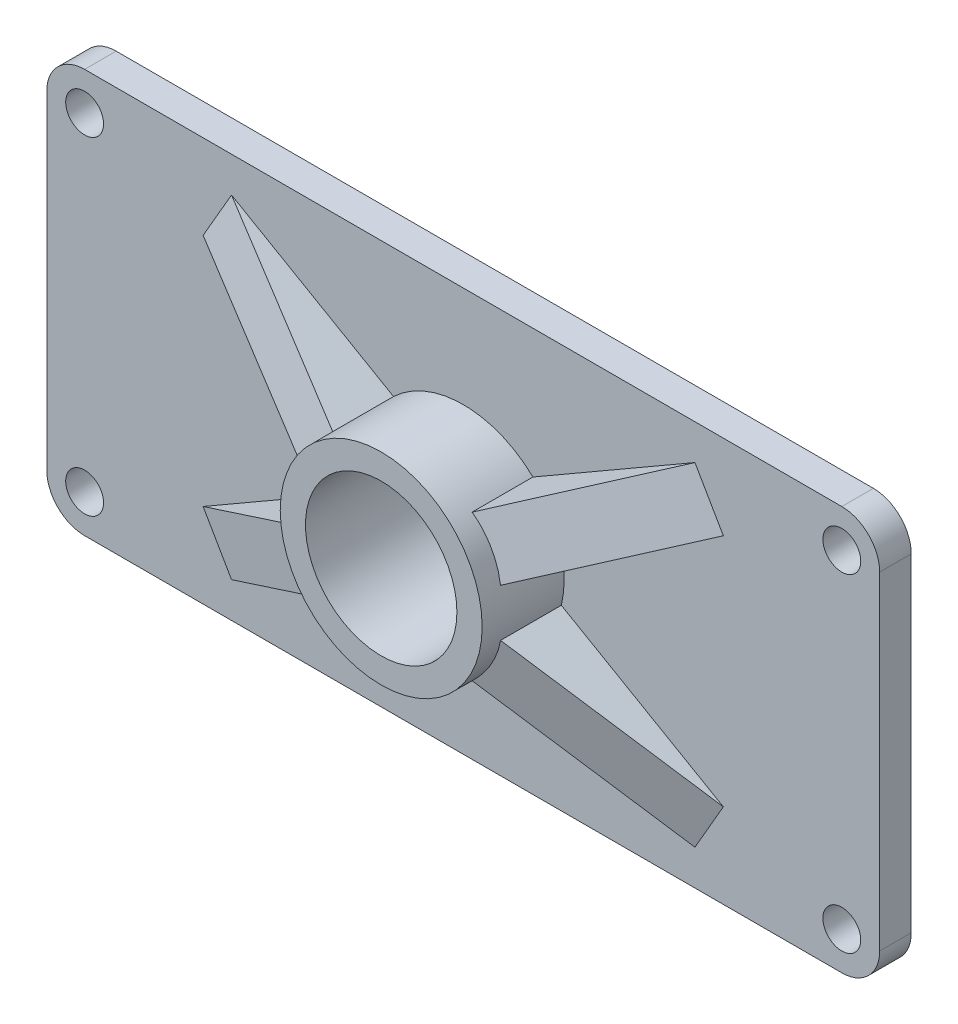
ISO-10303-21;
HEADER;
FILE_DESCRIPTION(('STEP AP214'),'2;1');
FILE_NAME('part.step','',(''),(''),'','','');
FILE_SCHEMA(('AUTOMOTIVE_DESIGN { 1 0 10303 214 1 1 1 1 }'));
ENDSEC;
DATA;
#1=APPLICATION_CONTEXT('core data for automotive mechanical design processes');
#2=APPLICATION_PROTOCOL_DEFINITION('international standard','automotive_design',2000,#1);
#3=PRODUCT_CONTEXT('',#1,'mechanical');
#4=PRODUCT('Part','Part','',(#3));
#5=PRODUCT_RELATED_PRODUCT_CATEGORY('part','',(#4));
#6=PRODUCT_DEFINITION_FORMATION('','',#4);
#7=PRODUCT_DEFINITION_CONTEXT('part definition',#1,'design');
#8=PRODUCT_DEFINITION('design','',#6,#7);
#9=PRODUCT_DEFINITION_SHAPE('','',#8);
#10=(LENGTH_UNIT() NAMED_UNIT(*) SI_UNIT(.MILLI.,.METRE.));
#11=(NAMED_UNIT(*) PLANE_ANGLE_UNIT() SI_UNIT($,.RADIAN.));
#12=(NAMED_UNIT(*) SI_UNIT($,.STERADIAN.) SOLID_ANGLE_UNIT());
#13=UNCERTAINTY_MEASURE_WITH_UNIT(LENGTH_MEASURE(1.E-05),#10,'distance_accuracy_value','');
#14=(GEOMETRIC_REPRESENTATION_CONTEXT(3) GLOBAL_UNCERTAINTY_ASSIGNED_CONTEXT((#13)) GLOBAL_UNIT_ASSIGNED_CONTEXT((#10,
#11,#12)) REPRESENTATION_CONTEXT('',''));
#15=CARTESIAN_POINT('',(0.,0.,0.));
#16=DIRECTION('',(0.,0.,1.));
#17=DIRECTION('',(1.,0.,0.));
#18=AXIS2_PLACEMENT_3D('',#15,#16,#17);
#19=CARTESIAN_POINT('',(60.,26.,5.));
#20=DIRECTION('',(0.,0.,-1.));
#21=DIRECTION('',(-1.,0.,0.));
#22=AXIS2_PLACEMENT_3D('',#19,#20,#21);
#23=PLANE('',#22);
#24=CARTESIAN_POINT('',(60.,26.,5.));
#25=DIRECTION('',(0.,0.,1.));
#26=DIRECTION('',(1.,0.,0.));
#27=AXIS2_PLACEMENT_3D('',#24,#25,#26);
#28=CIRCLE('',#27,3.);
#29=CARTESIAN_POINT('',(63.,26.,5.));
#30=VERTEX_POINT('',#29);
#31=EDGE_CURVE('E263',#30,#30,#28,.T.);
#32=ORIENTED_EDGE('',*,*,#31,.F.);
#33=EDGE_LOOP('',(#32));
#34=FACE_BOUND('',#33,.T.);
#35=DIRECTION('',(0.500000000000001,-0.866025403784438,0.));
#36=VECTOR('',#35,1.);
#37=CARTESIAN_POINT('',(42.712812921102,16.0192378864668,5.));
#38=LINE('',#37,#36);
#39=CARTESIAN_POINT('',(36.7211431702997,26.39711431703,5.));
#40=VERTEX_POINT('',#39);
#41=CARTESIAN_POINT('',(41.2211431702998,18.6028856829701,4.99999999999999));
#42=VERTEX_POINT('',#41);
#43=EDGE_CURVE('E215',#40,#42,#38,.T.);
#44=ORIENTED_EDGE('',*,*,#43,.T.);
#45=DIRECTION('',(0.866025403784438,0.500000000000001,0.));
#46=VECTOR('',#45,1.);
#47=CARTESIAN_POINT('',(58.5083302491977,28.5836477965033,5.));
#48=LINE('',#47,#46);
#49=CARTESIAN_POINT('',(15.5470861469722,3.77996194936208,5.));
#50=VERTEX_POINT('',#49);
#51=EDGE_CURVE('E208',#50,#42,#48,.T.);
#52=ORIENTED_EDGE('',*,*,#51,.F.);
#53=CARTESIAN_POINT('',(0.,0.,5.));
#54=DIRECTION('',(0.,0.,-1.));
#55=DIRECTION('',(-1.,0.,0.));
#56=AXIS2_PLACEMENT_3D('',#53,#54,#55);
#57=CIRCLE('',#56,16.);
#58=CARTESIAN_POINT('',(15.5470861469722,-3.77996194936208,5.));
#59=VERTEX_POINT('',#58);
#60=EDGE_CURVE('E189',#59,#50,#57,.F.);
#61=ORIENTED_EDGE('',*,*,#60,.F.);
#62=DIRECTION('',(-0.866025403784438,0.500000000000001,0.));
#63=VECTOR('',#62,1.);
#64=CARTESIAN_POINT('',(35.9916697508022,-15.5836477965032,5.));
#65=LINE('',#64,#63);
#66=CARTESIAN_POINT('',(41.2211431702997,-18.6028856829701,5.));
#67=VERTEX_POINT('',#66);
#68=EDGE_CURVE('E237',#67,#59,#65,.T.);
#69=ORIENTED_EDGE('',*,*,#68,.F.);
#70=DIRECTION('',(0.500000000000001,0.866025403784438,0.));
#71=VECTOR('',#70,1.);
#72=CARTESIAN_POINT('',(65.2294734194975,22.9807621135331,5.));
#73=LINE('',#72,#71);
#74=CARTESIAN_POINT('',(36.7211431702997,-26.39711431703,5.));
#75=VERTEX_POINT('',#74);
#76=EDGE_CURVE('E245',#67,#75,#73,.F.);
#77=ORIENTED_EDGE('',*,*,#76,.T.);
#78=DIRECTION('',(-0.866025403784438,0.500000000000001,0.));
#79=VECTOR('',#78,1.);
#80=CARTESIAN_POINT('',(31.4916697508022,-23.3778764305631,5.));
#81=LINE('',#80,#79);
#82=CARTESIAN_POINT('',(11.0470861469722,-11.574190583422,5.));
#83=VERTEX_POINT('',#82);
#84=EDGE_CURVE('E242',#75,#83,#81,.T.);
#85=ORIENTED_EDGE('',*,*,#84,.T.);
#86=CARTESIAN_POINT('',(-11.0470861469722,-11.574190583422,5.));
#87=VERTEX_POINT('',#86);
#88=EDGE_CURVE('E187',#87,#83,#57,.F.);
#89=ORIENTED_EDGE('',*,*,#88,.F.);
#90=DIRECTION('',(-0.866025403784438,-0.500000000000001,0.));
#91=VECTOR('',#90,1.);
#92=CARTESIAN_POINT('',(58.5083302491977,28.5836477965033,5.));
#93=LINE('',#92,#91);
#94=CARTESIAN_POINT('',(-36.7211431702997,-26.39711431703,5.));
#95=VERTEX_POINT('',#94);
#96=EDGE_CURVE('E58',#87,#95,#93,.T.);
#97=ORIENTED_EDGE('',*,*,#96,.T.);
#98=DIRECTION('',(-0.500000000000001,0.866025403784438,0.));
#99=VECTOR('',#98,1.);
#100=CARTESIAN_POINT('',(-35.2294734194974,-28.9807621135333,5.));
#101=LINE('',#100,#99);
#102=CARTESIAN_POINT('',(-41.2211431702996,-18.60288568297,5.00000000000002));
#103=VERTEX_POINT('',#102);
#104=EDGE_CURVE('E62',#95,#103,#101,.T.);
#105=ORIENTED_EDGE('',*,*,#104,.T.);
#106=DIRECTION('',(-0.866025403784438,-0.500000000000001,0.));
#107=VECTOR('',#106,1.);
#108=CARTESIAN_POINT('',(54.0083302491977,36.3778764305632,5.));
#109=LINE('',#108,#107);
#110=CARTESIAN_POINT('',(-15.5470861469722,-3.77996194936209,5.));
#111=VERTEX_POINT('',#110);
#112=EDGE_CURVE('E190',#111,#103,#109,.T.);
#113=ORIENTED_EDGE('',*,*,#112,.F.);
#114=CARTESIAN_POINT('',(-15.5470861469722,3.77996194936209,5.));
#115=VERTEX_POINT('',#114);
#116=EDGE_CURVE('E178',#115,#111,#57,.F.);
#117=ORIENTED_EDGE('',*,*,#116,.F.);
#118=DIRECTION('',(0.866025403784438,-0.500000000000001,0.));
#119=VECTOR('',#118,1.);
#120=CARTESIAN_POINT('',(31.4916697508022,-23.3778764305631,5.));
#121=LINE('',#120,#119);
#122=CARTESIAN_POINT('',(-41.2211431702996,18.60288568297,5.00000000000002));
#123=VERTEX_POINT('',#122);
#124=EDGE_CURVE('E228',#123,#115,#121,.T.);
#125=ORIENTED_EDGE('',*,*,#124,.F.);
#126=DIRECTION('',(-0.500000000000001,-0.866025403784438,0.));
#127=VECTOR('',#126,1.);
#128=CARTESIAN_POINT('',(-12.7128129211019,67.9807621135332,5.));
#129=LINE('',#128,#127);
#130=CARTESIAN_POINT('',(-36.7211431702997,26.39711431703,5.));
#131=VERTEX_POINT('',#130);
#132=EDGE_CURVE('E230',#123,#131,#129,.F.);
#133=ORIENTED_EDGE('',*,*,#132,.T.);
#134=DIRECTION('',(0.866025403784438,-0.500000000000001,0.));
#135=VECTOR('',#134,1.);
#136=CARTESIAN_POINT('',(35.9916697508022,-15.5836477965032,5.));
#137=LINE('',#136,#135);
#138=CARTESIAN_POINT('',(-11.0470861469722,11.574190583422,5.));
#139=VERTEX_POINT('',#138);
#140=EDGE_CURVE('E224',#131,#139,#137,.T.);
#141=ORIENTED_EDGE('',*,*,#140,.T.);
#142=CARTESIAN_POINT('',(11.0470861469722,11.574190583422,5.));
#143=VERTEX_POINT('',#142);
#144=EDGE_CURVE('E186',#143,#139,#57,.F.);
#145=ORIENTED_EDGE('',*,*,#144,.F.);
#146=DIRECTION('',(0.866025403784438,0.500000000000001,0.));
#147=VECTOR('',#146,1.);
#148=CARTESIAN_POINT('',(54.0083302491977,36.3778764305632,5.));
#149=LINE('',#148,#147);
#150=EDGE_CURVE('E213',#143,#40,#149,.T.);
#151=ORIENTED_EDGE('',*,*,#150,.T.);
#152=EDGE_LOOP('',(#44,#52,#61,#69,#77,#85,#89,#97,#105,#113,#117,#125,#133,#141,#145,#151));
#153=FACE_BOUND('',#152,.T.);
#154=CARTESIAN_POINT('',(-60.,-26.,5.));
#155=DIRECTION('',(0.,0.,1.));
#156=DIRECTION('',(1.,0.,0.));
#157=AXIS2_PLACEMENT_3D('',#154,#155,#156);
#158=CIRCLE('',#157,3.);
#159=CARTESIAN_POINT('',(-57.,-26.,5.));
#160=VERTEX_POINT('',#159);
#161=EDGE_CURVE('E275',#160,#160,#158,.T.);
#162=ORIENTED_EDGE('',*,*,#161,.F.);
#163=EDGE_LOOP('',(#162));
#164=FACE_BOUND('',#163,.T.);
#165=CARTESIAN_POINT('',(60.,-26.,5.));
#166=DIRECTION('',(0.,0.,1.));
#167=DIRECTION('',(1.,0.,0.));
#168=AXIS2_PLACEMENT_3D('',#165,#166,#167);
#169=CIRCLE('',#168,3.);
#170=CARTESIAN_POINT('',(63.,-26.,5.));
#171=VERTEX_POINT('',#170);
#172=EDGE_CURVE('E257',#171,#171,#169,.T.);
#173=ORIENTED_EDGE('',*,*,#172,.F.);
#174=EDGE_LOOP('',(#173));
#175=FACE_BOUND('',#174,.T.);
#176=CARTESIAN_POINT('',(-60.,26.,5.));
#177=DIRECTION('',(0.,0.,1.));
#178=DIRECTION('',(1.,0.,0.));
#179=AXIS2_PLACEMENT_3D('',#176,#177,#178);
#180=CIRCLE('',#179,3.);
#181=CARTESIAN_POINT('',(-57.,26.,5.));
#182=VERTEX_POINT('',#181);
#183=EDGE_CURVE('E269',#182,#182,#180,.T.);
#184=ORIENTED_EDGE('',*,*,#183,.F.);
#185=EDGE_LOOP('',(#184));
#186=FACE_BOUND('',#185,.T.);
#187=CARTESIAN_POINT('',(60.,26.,5.));
#188=DIRECTION('',(0.,0.,1.));
#189=DIRECTION('',(-1.,0.,0.));
#190=AXIS2_PLACEMENT_3D('',#187,#188,#189);
#191=CIRCLE('',#190,6.);
#192=CARTESIAN_POINT('',(66.,26.,5.));
#193=VERTEX_POINT('',#192);
#194=CARTESIAN_POINT('',(60.,32.,5.));
#195=VERTEX_POINT('',#194);
#196=EDGE_CURVE('E281',#193,#195,#191,.T.);
#197=ORIENTED_EDGE('',*,*,#196,.T.);
#198=DIRECTION('',(-1.,0.,0.));
#199=VECTOR('',#198,1.);
#200=CARTESIAN_POINT('',(-60.,32.,5.));
#201=LINE('',#200,#199);
#202=CARTESIAN_POINT('',(-60.,32.,5.));
#203=VERTEX_POINT('',#202);
#204=EDGE_CURVE('E283',#195,#203,#201,.T.);
#205=ORIENTED_EDGE('',*,*,#204,.T.);
#206=CARTESIAN_POINT('',(-60.,26.,5.));
#207=DIRECTION('',(0.,0.,1.));
#208=DIRECTION('',(-1.,0.,0.));
#209=AXIS2_PLACEMENT_3D('',#206,#207,#208);
#210=CIRCLE('',#209,6.);
#211=CARTESIAN_POINT('',(-66.,26.,5.));
#212=VERTEX_POINT('',#211);
#213=EDGE_CURVE('E286',#203,#212,#210,.T.);
#214=ORIENTED_EDGE('',*,*,#213,.T.);
#215=DIRECTION('',(0.,-1.,0.));
#216=VECTOR('',#215,1.);
#217=CARTESIAN_POINT('',(-66.,-26.,5.));
#218=LINE('',#217,#216);
#219=CARTESIAN_POINT('',(-66.,-26.,5.));
#220=VERTEX_POINT('',#219);
#221=EDGE_CURVE('E288',#212,#220,#218,.T.);
#222=ORIENTED_EDGE('',*,*,#221,.T.);
#223=CARTESIAN_POINT('',(-60.,-26.,5.));
#224=DIRECTION('',(0.,0.,1.));
#225=DIRECTION('',(-1.,0.,0.));
#226=AXIS2_PLACEMENT_3D('',#223,#224,#225);
#227=CIRCLE('',#226,6.);
#228=CARTESIAN_POINT('',(-60.,-32.,5.));
#229=VERTEX_POINT('',#228);
#230=EDGE_CURVE('E290',#220,#229,#227,.T.);
#231=ORIENTED_EDGE('',*,*,#230,.T.);
#232=DIRECTION('',(1.,0.,0.));
#233=VECTOR('',#232,1.);
#234=CARTESIAN_POINT('',(-60.,-32.,5.));
#235=LINE('',#234,#233);
#236=CARTESIAN_POINT('',(60.,-32.,5.));
#237=VERTEX_POINT('',#236);
#238=EDGE_CURVE('E292',#229,#237,#235,.T.);
#239=ORIENTED_EDGE('',*,*,#238,.T.);
#240=CARTESIAN_POINT('',(60.,-26.,5.));
#241=DIRECTION('',(0.,0.,1.));
#242=DIRECTION('',(1.,0.,0.));
#243=AXIS2_PLACEMENT_3D('',#240,#241,#242);
#244=CIRCLE('',#243,6.);
#245=CARTESIAN_POINT('',(66.,-26.,5.));
#246=VERTEX_POINT('',#245);
#247=EDGE_CURVE('E294',#237,#246,#244,.T.);
#248=ORIENTED_EDGE('',*,*,#247,.T.);
#249=DIRECTION('',(0.,1.,0.));
#250=VECTOR('',#249,1.);
#251=CARTESIAN_POINT('',(66.,-26.,5.));
#252=LINE('',#251,#250);
#253=EDGE_CURVE('E296',#246,#193,#252,.T.);
#254=ORIENTED_EDGE('',*,*,#253,.T.);
#255=EDGE_LOOP('',(#197,#205,#214,#222,#231,#239,#248,#254));
#256=FACE_BOUND('',#255,.T.);
#257=ADVANCED_FACE('F43',(#34,#153,#164,#175,#186,#256),#23,.F.);
#258=CARTESIAN_POINT('',(60.,26.,0.));
#259=DIRECTION('',(0.,0.,-1.));
#260=DIRECTION('',(-1.,0.,0.));
#261=AXIS2_PLACEMENT_3D('',#258,#259,#260);
#262=PLANE('',#261);
#263=CARTESIAN_POINT('',(60.,26.,0.));
#264=DIRECTION('',(0.,0.,1.));
#265=DIRECTION('',(1.,0.,0.));
#266=AXIS2_PLACEMENT_3D('',#263,#264,#265);
#267=CIRCLE('',#266,3.);
#268=CARTESIAN_POINT('',(63.,26.,0.));
#269=VERTEX_POINT('',#268);
#270=EDGE_CURVE('E260',#269,#269,#267,.T.);
#271=ORIENTED_EDGE('',*,*,#270,.T.);
#272=EDGE_LOOP('',(#271));
#273=FACE_BOUND('',#272,.T.);
#274=CARTESIAN_POINT('',(0.,0.,0.));
#275=DIRECTION('',(0.,0.,1.));
#276=DIRECTION('',(1.,0.,0.));
#277=AXIS2_PLACEMENT_3D('',#274,#275,#276);
#278=CIRCLE('',#277,12.);
#279=CARTESIAN_POINT('',(12.,0.,0.));
#280=VERTEX_POINT('',#279);
#281=EDGE_CURVE('E253',#280,#280,#278,.T.);
#282=ORIENTED_EDGE('',*,*,#281,.T.);
#283=EDGE_LOOP('',(#282));
#284=FACE_BOUND('',#283,.T.);
#285=DIRECTION('',(-1.,0.,0.));
#286=VECTOR('',#285,1.);
#287=CARTESIAN_POINT('',(-60.,32.,0.));
#288=LINE('',#287,#286);
#289=CARTESIAN_POINT('',(60.,32.,0.));
#290=VERTEX_POINT('',#289);
#291=CARTESIAN_POINT('',(-60.,32.,0.));
#292=VERTEX_POINT('',#291);
#293=EDGE_CURVE('E300',#290,#292,#288,.T.);
#294=ORIENTED_EDGE('',*,*,#293,.F.);
#295=CARTESIAN_POINT('',(60.,26.,0.));
#296=DIRECTION('',(0.,0.,1.));
#297=DIRECTION('',(-1.,0.,0.));
#298=AXIS2_PLACEMENT_3D('',#295,#296,#297);
#299=CIRCLE('',#298,6.);
#300=CARTESIAN_POINT('',(66.,26.,0.));
#301=VERTEX_POINT('',#300);
#302=EDGE_CURVE('E278',#301,#290,#299,.T.);
#303=ORIENTED_EDGE('',*,*,#302,.F.);
#304=DIRECTION('',(0.,1.,0.));
#305=VECTOR('',#304,1.);
#306=CARTESIAN_POINT('',(66.,-26.,0.));
#307=LINE('',#306,#305);
#308=CARTESIAN_POINT('',(66.,-26.,0.));
#309=VERTEX_POINT('',#308);
#310=EDGE_CURVE('E284',#309,#301,#307,.T.);
#311=ORIENTED_EDGE('',*,*,#310,.F.);
#312=CARTESIAN_POINT('',(60.,-26.,0.));
#313=DIRECTION('',(0.,0.,1.));
#314=DIRECTION('',(1.,0.,0.));
#315=AXIS2_PLACEMENT_3D('',#312,#313,#314);
#316=CIRCLE('',#315,6.);
#317=CARTESIAN_POINT('',(60.,-32.,0.));
#318=VERTEX_POINT('',#317);
#319=EDGE_CURVE('E310',#318,#309,#316,.T.);
#320=ORIENTED_EDGE('',*,*,#319,.F.);
#321=DIRECTION('',(1.,0.,0.));
#322=VECTOR('',#321,1.);
#323=CARTESIAN_POINT('',(-60.,-32.,0.));
#324=LINE('',#323,#322);
#325=CARTESIAN_POINT('',(-60.,-32.,0.));
#326=VERTEX_POINT('',#325);
#327=EDGE_CURVE('E308',#326,#318,#324,.T.);
#328=ORIENTED_EDGE('',*,*,#327,.F.);
#329=CARTESIAN_POINT('',(-60.,-26.,0.));
#330=DIRECTION('',(0.,0.,1.));
#331=DIRECTION('',(-1.,0.,0.));
#332=AXIS2_PLACEMENT_3D('',#329,#330,#331);
#333=CIRCLE('',#332,6.);
#334=CARTESIAN_POINT('',(-66.,-26.,0.));
#335=VERTEX_POINT('',#334);
#336=EDGE_CURVE('E306',#335,#326,#333,.T.);
#337=ORIENTED_EDGE('',*,*,#336,.F.);
#338=DIRECTION('',(0.,-1.,0.));
#339=VECTOR('',#338,1.);
#340=CARTESIAN_POINT('',(-66.,-26.,0.));
#341=LINE('',#340,#339);
#342=CARTESIAN_POINT('',(-66.,26.,0.));
#343=VERTEX_POINT('',#342);
#344=EDGE_CURVE('E304',#343,#335,#341,.T.);
#345=ORIENTED_EDGE('',*,*,#344,.F.);
#346=CARTESIAN_POINT('',(-60.,26.,0.));
#347=DIRECTION('',(0.,0.,1.));
#348=DIRECTION('',(-1.,0.,0.));
#349=AXIS2_PLACEMENT_3D('',#346,#347,#348);
#350=CIRCLE('',#349,6.);
#351=EDGE_CURVE('E302',#292,#343,#350,.T.);
#352=ORIENTED_EDGE('',*,*,#351,.F.);
#353=EDGE_LOOP('',(#294,#303,#311,#320,#328,#337,#345,#352));
#354=FACE_BOUND('',#353,.T.);
#355=CARTESIAN_POINT('',(60.,-26.,0.));
#356=DIRECTION('',(0.,0.,1.));
#357=DIRECTION('',(1.,0.,0.));
#358=AXIS2_PLACEMENT_3D('',#355,#356,#357);
#359=CIRCLE('',#358,3.);
#360=CARTESIAN_POINT('',(63.,-26.,0.));
#361=VERTEX_POINT('',#360);
#362=EDGE_CURVE('E256',#361,#361,#359,.T.);
#363=ORIENTED_EDGE('',*,*,#362,.T.);
#364=EDGE_LOOP('',(#363));
#365=FACE_BOUND('',#364,.T.);
#366=CARTESIAN_POINT('',(-60.,26.,0.));
#367=DIRECTION('',(0.,0.,1.));
#368=DIRECTION('',(1.,0.,0.));
#369=AXIS2_PLACEMENT_3D('',#366,#367,#368);
#370=CIRCLE('',#369,3.);
#371=CARTESIAN_POINT('',(-57.,26.,0.));
#372=VERTEX_POINT('',#371);
#373=EDGE_CURVE('E266',#372,#372,#370,.T.);
#374=ORIENTED_EDGE('',*,*,#373,.T.);
#375=EDGE_LOOP('',(#374));
#376=FACE_BOUND('',#375,.T.);
#377=CARTESIAN_POINT('',(-60.,-26.,0.));
#378=DIRECTION('',(0.,0.,1.));
#379=DIRECTION('',(1.,0.,0.));
#380=AXIS2_PLACEMENT_3D('',#377,#378,#379);
#381=CIRCLE('',#380,3.);
#382=CARTESIAN_POINT('',(-57.,-26.,0.));
#383=VERTEX_POINT('',#382);
#384=EDGE_CURVE('E272',#383,#383,#381,.T.);
#385=ORIENTED_EDGE('',*,*,#384,.T.);
#386=EDGE_LOOP('',(#385));
#387=FACE_BOUND('',#386,.T.);
#388=ADVANCED_FACE('F398',(#273,#284,#354,#365,#376,#387),#262,.T.);
#389=CARTESIAN_POINT('',(60.,26.,5.));
#390=DIRECTION('',(0.,0.,-1.));
#391=DIRECTION('',(-1.,0.,0.));
#392=AXIS2_PLACEMENT_3D('',#389,#390,#391);
#393=CYLINDRICAL_SURFACE('',#392,6.);
#394=ORIENTED_EDGE('',*,*,#302,.T.);
#395=DIRECTION('',(0.,0.,-1.));
#396=VECTOR('',#395,1.);
#397=CARTESIAN_POINT('',(60.,32.,5.));
#398=LINE('',#397,#396);
#399=EDGE_CURVE('E333',#195,#290,#398,.T.);
#400=ORIENTED_EDGE('',*,*,#399,.F.);
#401=ORIENTED_EDGE('',*,*,#196,.F.);
#402=DIRECTION('',(0.,0.,-1.));
#403=VECTOR('',#402,1.);
#404=CARTESIAN_POINT('',(66.,26.,5.));
#405=LINE('',#404,#403);
#406=EDGE_CURVE('E298',#193,#301,#405,.T.);
#407=ORIENTED_EDGE('',*,*,#406,.T.);
#408=EDGE_LOOP('',(#394,#400,#401,#407));
#409=FACE_BOUND('',#408,.T.);
#410=ADVANCED_FACE('F45',(#409),#393,.T.);
#411=CARTESIAN_POINT('',(-60.,32.,5.));
#412=DIRECTION('',(0.,-1.,0.));
#413=DIRECTION('',(0.,0.,-1.));
#414=AXIS2_PLACEMENT_3D('',#411,#412,#413);
#415=PLANE('',#414);
#416=ORIENTED_EDGE('',*,*,#293,.T.);
#417=DIRECTION('',(0.,0.,-1.));
#418=VECTOR('',#417,1.);
#419=CARTESIAN_POINT('',(-60.,32.,5.));
#420=LINE('',#419,#418);
#421=EDGE_CURVE('E330',#203,#292,#420,.T.);
#422=ORIENTED_EDGE('',*,*,#421,.F.);
#423=ORIENTED_EDGE('',*,*,#204,.F.);
#424=ORIENTED_EDGE('',*,*,#399,.T.);
#425=EDGE_LOOP('',(#416,#422,#423,#424));
#426=FACE_BOUND('',#425,.T.);
#427=ADVANCED_FACE('F434',(#426),#415,.F.);
#428=CARTESIAN_POINT('',(-60.,26.,5.));
#429=DIRECTION('',(0.,0.,-1.));
#430=DIRECTION('',(-1.,0.,0.));
#431=AXIS2_PLACEMENT_3D('',#428,#429,#430);
#432=CYLINDRICAL_SURFACE('',#431,6.);
#433=DIRECTION('',(0.,0.,-1.));
#434=VECTOR('',#433,1.);
#435=CARTESIAN_POINT('',(-66.,26.,5.));
#436=LINE('',#435,#434);
#437=EDGE_CURVE('E327',#212,#343,#436,.T.);
#438=ORIENTED_EDGE('',*,*,#437,.F.);
#439=ORIENTED_EDGE('',*,*,#213,.F.);
#440=ORIENTED_EDGE('',*,*,#421,.T.);
#441=ORIENTED_EDGE('',*,*,#351,.T.);
#442=EDGE_LOOP('',(#438,#439,#440,#441));
#443=FACE_BOUND('',#442,.T.);
#444=ADVANCED_FACE('F431',(#443),#432,.T.);
#445=CARTESIAN_POINT('',(-66.,-26.,5.));
#446=DIRECTION('',(1.,0.,0.));
#447=DIRECTION('',(0.,0.,-1.));
#448=AXIS2_PLACEMENT_3D('',#445,#446,#447);
#449=PLANE('',#448);
#450=ORIENTED_EDGE('',*,*,#344,.T.);
#451=DIRECTION('',(0.,0.,-1.));
#452=VECTOR('',#451,1.);
#453=CARTESIAN_POINT('',(-66.,-26.,5.));
#454=LINE('',#453,#452);
#455=EDGE_CURVE('E324',#220,#335,#454,.T.);
#456=ORIENTED_EDGE('',*,*,#455,.F.);
#457=ORIENTED_EDGE('',*,*,#221,.F.);
#458=ORIENTED_EDGE('',*,*,#437,.T.);
#459=EDGE_LOOP('',(#450,#456,#457,#458));
#460=FACE_BOUND('',#459,.T.);
#461=ADVANCED_FACE('F427',(#460),#449,.F.);
#462=CARTESIAN_POINT('',(-60.,-26.,5.));
#463=DIRECTION('',(0.,0.,-1.));
#464=DIRECTION('',(-1.,0.,0.));
#465=AXIS2_PLACEMENT_3D('',#462,#463,#464);
#466=CYLINDRICAL_SURFACE('',#465,6.);
#467=ORIENTED_EDGE('',*,*,#336,.T.);
#468=DIRECTION('',(0.,0.,-1.));
#469=VECTOR('',#468,1.);
#470=CARTESIAN_POINT('',(-60.,-32.,5.));
#471=LINE('',#470,#469);
#472=EDGE_CURVE('E321',#229,#326,#471,.T.);
#473=ORIENTED_EDGE('',*,*,#472,.F.);
#474=ORIENTED_EDGE('',*,*,#230,.F.);
#475=ORIENTED_EDGE('',*,*,#455,.T.);
#476=EDGE_LOOP('',(#467,#473,#474,#475));
#477=FACE_BOUND('',#476,.T.);
#478=ADVANCED_FACE('F423',(#477),#466,.T.);
#479=CARTESIAN_POINT('',(-60.,-32.,5.));
#480=DIRECTION('',(0.,1.,0.));
#481=DIRECTION('',(0.,0.,1.));
#482=AXIS2_PLACEMENT_3D('',#479,#480,#481);
#483=PLANE('',#482);
#484=ORIENTED_EDGE('',*,*,#327,.T.);
#485=DIRECTION('',(0.,0.,-1.));
#486=VECTOR('',#485,1.);
#487=CARTESIAN_POINT('',(60.,-32.,5.));
#488=LINE('',#487,#486);
#489=EDGE_CURVE('E318',#237,#318,#488,.T.);
#490=ORIENTED_EDGE('',*,*,#489,.F.);
#491=ORIENTED_EDGE('',*,*,#238,.F.);
#492=ORIENTED_EDGE('',*,*,#472,.T.);
#493=EDGE_LOOP('',(#484,#490,#491,#492));
#494=FACE_BOUND('',#493,.T.);
#495=ADVANCED_FACE('F419',(#494),#483,.F.);
#496=CARTESIAN_POINT('',(60.,-26.,5.));
#497=DIRECTION('',(0.,0.,-1.));
#498=DIRECTION('',(-1.,0.,0.));
#499=AXIS2_PLACEMENT_3D('',#496,#497,#498);
#500=CYLINDRICAL_SURFACE('',#499,6.);
#501=DIRECTION('',(0.,0.,-1.));
#502=VECTOR('',#501,1.);
#503=CARTESIAN_POINT('',(66.,-26.,5.));
#504=LINE('',#503,#502);
#505=EDGE_CURVE('E315',#246,#309,#504,.T.);
#506=ORIENTED_EDGE('',*,*,#505,.F.);
#507=ORIENTED_EDGE('',*,*,#247,.F.);
#508=ORIENTED_EDGE('',*,*,#489,.T.);
#509=ORIENTED_EDGE('',*,*,#319,.T.);
#510=EDGE_LOOP('',(#506,#507,#508,#509));
#511=FACE_BOUND('',#510,.T.);
#512=ADVANCED_FACE('F415',(#511),#500,.T.);
#513=CARTESIAN_POINT('',(66.,-26.,5.));
#514=DIRECTION('',(-1.,0.,0.));
#515=DIRECTION('',(0.,0.,1.));
#516=AXIS2_PLACEMENT_3D('',#513,#514,#515);
#517=PLANE('',#516);
#518=ORIENTED_EDGE('',*,*,#310,.T.);
#519=ORIENTED_EDGE('',*,*,#406,.F.);
#520=ORIENTED_EDGE('',*,*,#253,.F.);
#521=ORIENTED_EDGE('',*,*,#505,.T.);
#522=EDGE_LOOP('',(#518,#519,#520,#521));
#523=FACE_BOUND('',#522,.T.);
#524=ADVANCED_FACE('F412',(#523),#517,.F.);
#525=CARTESIAN_POINT('',(-60.,-26.,5.));
#526=DIRECTION('',(0.,0.,-1.));
#527=DIRECTION('',(-1.,0.,0.));
#528=AXIS2_PLACEMENT_3D('',#525,#526,#527);
#529=CYLINDRICAL_SURFACE('',#528,3.);
#530=ORIENTED_EDGE('',*,*,#384,.F.);
#531=EDGE_LOOP('',(#530));
#532=FACE_BOUND('',#531,.T.);
#533=ORIENTED_EDGE('',*,*,#161,.T.);
#534=EDGE_LOOP('',(#533));
#535=FACE_BOUND('',#534,.T.);
#536=ADVANCED_FACE('F409',(#532,#535),#529,.F.);
#537=CARTESIAN_POINT('',(-60.,26.,5.));
#538=DIRECTION('',(0.,0.,-1.));
#539=DIRECTION('',(-1.,0.,0.));
#540=AXIS2_PLACEMENT_3D('',#537,#538,#539);
#541=CYLINDRICAL_SURFACE('',#540,3.);
#542=ORIENTED_EDGE('',*,*,#373,.F.);
#543=EDGE_LOOP('',(#542));
#544=FACE_BOUND('',#543,.T.);
#545=ORIENTED_EDGE('',*,*,#183,.T.);
#546=EDGE_LOOP('',(#545));
#547=FACE_BOUND('',#546,.T.);
#548=ADVANCED_FACE('F477',(#544,#547),#541,.F.);
#549=CARTESIAN_POINT('',(60.,26.,5.));
#550=DIRECTION('',(0.,0.,-1.));
#551=DIRECTION('',(-1.,0.,0.));
#552=AXIS2_PLACEMENT_3D('',#549,#550,#551);
#553=CYLINDRICAL_SURFACE('',#552,3.);
#554=ORIENTED_EDGE('',*,*,#270,.F.);
#555=EDGE_LOOP('',(#554));
#556=FACE_BOUND('',#555,.T.);
#557=ORIENTED_EDGE('',*,*,#31,.T.);
#558=EDGE_LOOP('',(#557));
#559=FACE_BOUND('',#558,.T.);
#560=ADVANCED_FACE('F485',(#556,#559),#553,.F.);
#561=CARTESIAN_POINT('',(60.,-26.,5.));
#562=DIRECTION('',(0.,0.,-1.));
#563=DIRECTION('',(-1.,0.,0.));
#564=AXIS2_PLACEMENT_3D('',#561,#562,#563);
#565=CYLINDRICAL_SURFACE('',#564,3.);
#566=ORIENTED_EDGE('',*,*,#362,.F.);
#567=EDGE_LOOP('',(#566));
#568=FACE_BOUND('',#567,.T.);
#569=ORIENTED_EDGE('',*,*,#172,.T.);
#570=EDGE_LOOP('',(#569));
#571=FACE_BOUND('',#570,.T.);
#572=ADVANCED_FACE('F491',(#568,#571),#565,.F.);
#573=CARTESIAN_POINT('',(0.,0.,5.));
#574=DIRECTION('',(0.,0.,-1.));
#575=DIRECTION('',(-1.,0.,0.));
#576=AXIS2_PLACEMENT_3D('',#573,#574,#575);
#577=CYLINDRICAL_SURFACE('',#576,12.);
#578=ORIENTED_EDGE('',*,*,#281,.F.);
#579=EDGE_LOOP('',(#578));
#580=FACE_BOUND('',#579,.T.);
#581=CARTESIAN_POINT('',(0.,0.,18.));
#582=DIRECTION('',(0.,0.,1.));
#583=DIRECTION('',(1.,0.,0.));
#584=AXIS2_PLACEMENT_3D('',#581,#582,#583);
#585=CIRCLE('',#584,12.);
#586=CARTESIAN_POINT('',(12.,0.,18.));
#587=VERTEX_POINT('',#586);
#588=EDGE_CURVE('E247',#587,#587,#585,.T.);
#589=ORIENTED_EDGE('',*,*,#588,.T.);
#590=EDGE_LOOP('',(#589));
#591=FACE_BOUND('',#590,.T.);
#592=ADVANCED_FACE('F497',(#580,#591),#577,.F.);
#593=CARTESIAN_POINT('',(0.,0.,18.));
#594=DIRECTION('',(0.,0.,1.));
#595=DIRECTION('',(1.,0.,0.));
#596=AXIS2_PLACEMENT_3D('',#593,#594,#595);
#597=PLANE('',#596);
#598=CARTESIAN_POINT('',(0.,0.,18.));
#599=DIRECTION('',(0.,0.,1.));
#600=DIRECTION('',(1.,0.,0.));
#601=AXIS2_PLACEMENT_3D('',#598,#599,#600);
#602=CIRCLE('',#601,16.);
#603=CARTESIAN_POINT('',(16.,0.,18.));
#604=VERTEX_POINT('',#603);
#605=EDGE_CURVE('E250',#604,#604,#602,.T.);
#606=ORIENTED_EDGE('',*,*,#605,.T.);
#607=EDGE_LOOP('',(#606));
#608=FACE_BOUND('',#607,.T.);
#609=ORIENTED_EDGE('',*,*,#588,.F.);
#610=EDGE_LOOP('',(#609));
#611=FACE_BOUND('',#610,.T.);
#612=ADVANCED_FACE('F501',(#608,#611),#597,.T.);
#613=CARTESIAN_POINT('',(0.,0.,18.));
#614=DIRECTION('',(0.,0.,-1.));
#615=DIRECTION('',(-1.,0.,0.));
#616=AXIS2_PLACEMENT_3D('',#613,#614,#615);
#617=CYLINDRICAL_SURFACE('',#616,16.);
#618=ORIENTED_EDGE('',*,*,#605,.F.);
#619=EDGE_LOOP('',(#618));
#620=FACE_BOUND('',#619,.T.);
#621=DIRECTION('',(0.,0.,-1.));
#622=VECTOR('',#621,1.);
#623=CARTESIAN_POINT('',(15.5470861469722,3.77996194936208,18.));
#624=LINE('',#623,#622);
#625=CARTESIAN_POINT('',(15.5470861469722,3.77996194936208,14.6325197536149));
#626=VERTEX_POINT('',#625);
#627=EDGE_CURVE('E345',#626,#50,#624,.T.);
#628=ORIENTED_EDGE('',*,*,#627,.F.);
#629=CARTESIAN_POINT('',(0.,0.,19.6213863304808));
#630=DIRECTION('',(0.267616567329818,0.154508497187474,0.951056516295153));
#631=DIRECTION('',(0.823639103546331,0.475528258147578,-0.309016994374948));
#632=AXIS2_PLACEMENT_3D('',#629,#630,#631);
#633=ELLIPSE('',#632,16.8233955878123,16.);
#634=CARTESIAN_POINT('',(11.0470861469722,11.574190583422,14.6325197536149));
#635=VERTEX_POINT('',#634);
#636=EDGE_CURVE('E348',#626,#635,#633,.T.);
#637=ORIENTED_EDGE('',*,*,#636,.T.);
#638=DIRECTION('',(0.,0.,-1.));
#639=VECTOR('',#638,1.);
#640=CARTESIAN_POINT('',(11.0470861469722,11.574190583422,18.));
#641=LINE('',#640,#639);
#642=EDGE_CURVE('E51',#635,#143,#641,.T.);
#643=ORIENTED_EDGE('',*,*,#642,.T.);
#644=ORIENTED_EDGE('',*,*,#144,.T.);
#645=DIRECTION('',(0.,0.,-1.));
#646=VECTOR('',#645,1.);
#647=CARTESIAN_POINT('',(-11.0470861469722,11.574190583422,18.));
#648=LINE('',#647,#646);
#649=CARTESIAN_POINT('',(-11.0470861469722,11.574190583422,14.6325197536149));
#650=VERTEX_POINT('',#649);
#651=EDGE_CURVE('E221',#139,#650,#648,.F.);
#652=ORIENTED_EDGE('',*,*,#651,.T.);
#653=CARTESIAN_POINT('',(0.,0.,19.6213863304808));
#654=DIRECTION('',(0.267616567329818,-0.154508497187474,-0.951056516295153));
#655=DIRECTION('',(-0.823639103546331,0.475528258147578,-0.309016994374948));
#656=AXIS2_PLACEMENT_3D('',#653,#654,#655);
#657=ELLIPSE('',#656,16.8233955878123,16.);
#658=CARTESIAN_POINT('',(-15.5470861469722,3.77996194936209,14.6325197536149));
#659=VERTEX_POINT('',#658);
#660=EDGE_CURVE('E343',#650,#659,#657,.F.);
#661=ORIENTED_EDGE('',*,*,#660,.T.);
#662=DIRECTION('',(0.,0.,-1.));
#663=VECTOR('',#662,1.);
#664=CARTESIAN_POINT('',(-15.5470861469722,3.77996194936209,18.));
#665=LINE('',#664,#663);
#666=EDGE_CURVE('E184',#115,#659,#665,.F.);
#667=ORIENTED_EDGE('',*,*,#666,.F.);
#668=ORIENTED_EDGE('',*,*,#116,.T.);
#669=DIRECTION('',(0.,0.,-1.));
#670=VECTOR('',#669,1.);
#671=CARTESIAN_POINT('',(-15.5470861469722,-3.77996194936209,18.));
#672=LINE('',#671,#670);
#673=CARTESIAN_POINT('',(-15.5470861469722,-3.77996194936209,14.6325197536149));
#674=VERTEX_POINT('',#673);
#675=EDGE_CURVE('E181',#674,#111,#672,.T.);
#676=ORIENTED_EDGE('',*,*,#675,.F.);
#677=CARTESIAN_POINT('',(0.,0.,19.6213863304808));
#678=DIRECTION('',(-0.267616567329818,-0.154508497187474,0.951056516295153));
#679=DIRECTION('',(-0.823639103546331,-0.475528258147578,-0.309016994374948));
#680=AXIS2_PLACEMENT_3D('',#677,#678,#679);
#681=ELLIPSE('',#680,16.8233955878123,16.);
#682=CARTESIAN_POINT('',(-11.0470861469722,-11.574190583422,14.6325197536149));
#683=VERTEX_POINT('',#682);
#684=EDGE_CURVE('E11',#674,#683,#681,.T.);
#685=ORIENTED_EDGE('',*,*,#684,.T.);
#686=DIRECTION('',(0.,0.,-1.));
#687=VECTOR('',#686,1.);
#688=CARTESIAN_POINT('',(-11.0470861469722,-11.574190583422,18.));
#689=LINE('',#688,#687);
#690=EDGE_CURVE('E199',#683,#87,#689,.T.);
#691=ORIENTED_EDGE('',*,*,#690,.T.);
#692=ORIENTED_EDGE('',*,*,#88,.T.);
#693=DIRECTION('',(0.,0.,-1.));
#694=VECTOR('',#693,1.);
#695=CARTESIAN_POINT('',(11.0470861469722,-11.574190583422,18.));
#696=LINE('',#695,#694);
#697=CARTESIAN_POINT('',(11.0470861469722,-11.574190583422,14.6325197536149));
#698=VERTEX_POINT('',#697);
#699=EDGE_CURVE('E341',#83,#698,#696,.F.);
#700=ORIENTED_EDGE('',*,*,#699,.T.);
#701=CARTESIAN_POINT('',(0.,0.,19.6213863304808));
#702=DIRECTION('',(-0.267616567329818,0.154508497187474,-0.951056516295153));
#703=DIRECTION('',(0.823639103546331,-0.475528258147578,-0.309016994374948));
#704=AXIS2_PLACEMENT_3D('',#701,#702,#703);
#705=ELLIPSE('',#704,16.8233955878123,16.);
#706=CARTESIAN_POINT('',(15.5470861469722,-3.77996194936208,14.6325197536149));
#707=VERTEX_POINT('',#706);
#708=EDGE_CURVE('E339',#698,#707,#705,.F.);
#709=ORIENTED_EDGE('',*,*,#708,.T.);
#710=DIRECTION('',(0.,0.,-1.));
#711=VECTOR('',#710,1.);
#712=CARTESIAN_POINT('',(15.5470861469722,-3.77996194936208,18.));
#713=LINE('',#712,#711);
#714=EDGE_CURVE('E336',#59,#707,#713,.F.);
#715=ORIENTED_EDGE('',*,*,#714,.F.);
#716=ORIENTED_EDGE('',*,*,#60,.T.);
#717=EDGE_LOOP('',(#628,#637,#643,#644,#652,#661,#667,#668,#676,#685,#691,#692,#700,#709,#715,#716));
#718=FACE_BOUND('',#717,.T.);
#719=ADVANCED_FACE('F179',(#620,#718),#617,.T.);
#720=CARTESIAN_POINT('',(13.856406460551,-8.00000000000001,14.4226711907543));
#721=DIRECTION('',(-0.267616567329818,0.154508497187474,-0.951056516295153));
#722=DIRECTION('',(0.823639103546331,-0.475528258147578,-0.309016994374948));
#723=AXIS2_PLACEMENT_3D('',#720,#721,#722);
#724=PLANE('',#723);
#725=ORIENTED_EDGE('',*,*,#76,.F.);
#726=DIRECTION('',(0.823639103546331,-0.475528258147578,-0.309016994374948));
#727=VECTOR('',#726,1.);
#728=CARTESIAN_POINT('',(16.106406460551,-4.10288568297004,14.4226711907543));
#729=LINE('',#728,#727);
#730=EDGE_CURVE('E233',#707,#67,#729,.T.);
#731=ORIENTED_EDGE('',*,*,#730,.F.);
#732=ORIENTED_EDGE('',*,*,#708,.F.);
#733=DIRECTION('',(0.823639103546331,-0.475528258147578,-0.309016994374948));
#734=VECTOR('',#733,1.);
#735=CARTESIAN_POINT('',(11.606406460551,-11.89711431703,14.4226711907543));
#736=LINE('',#735,#734);
#737=EDGE_CURVE('E234',#698,#75,#736,.T.);
#738=ORIENTED_EDGE('',*,*,#737,.T.);
#739=EDGE_LOOP('',(#725,#731,#732,#738));
#740=FACE_BOUND('',#739,.T.);
#741=ADVANCED_FACE('F372',(#740),#724,.F.);
#742=CARTESIAN_POINT('',(-2.25,-3.89711431702997,9.));
#743=DIRECTION('',(-0.500000000000001,-0.866025403784438,0.));
#744=DIRECTION('',(0.866025403784438,-0.500000000000001,0.));
#745=AXIS2_PLACEMENT_3D('',#742,#743,#744);
#746=PLANE('',#745);
#747=ORIENTED_EDGE('',*,*,#699,.F.);
#748=ORIENTED_EDGE('',*,*,#84,.F.);
#749=ORIENTED_EDGE('',*,*,#737,.F.);
#750=EDGE_LOOP('',(#747,#748,#749));
#751=FACE_BOUND('',#750,.T.);
#752=ADVANCED_FACE('F377',(#751),#746,.T.);
#753=CARTESIAN_POINT('',(2.25,3.89711431702997,9.));
#754=DIRECTION('',(-0.500000000000001,-0.866025403784438,0.));
#755=DIRECTION('',(0.866025403784438,-0.500000000000001,0.));
#756=AXIS2_PLACEMENT_3D('',#753,#754,#755);
#757=PLANE('',#756);
#758=ORIENTED_EDGE('',*,*,#730,.T.);
#759=ORIENTED_EDGE('',*,*,#68,.T.);
#760=ORIENTED_EDGE('',*,*,#714,.T.);
#761=EDGE_LOOP('',(#758,#759,#760));
#762=FACE_BOUND('',#761,.T.);
#763=ADVANCED_FACE('F368',(#762),#757,.F.);
#764=CARTESIAN_POINT('',(-13.856406460551,8.00000000000001,14.4226711907543));
#765=DIRECTION('',(0.267616567329818,-0.154508497187474,-0.951056516295153));
#766=DIRECTION('',(-0.823639103546331,0.475528258147578,-0.309016994374948));
#767=AXIS2_PLACEMENT_3D('',#764,#765,#766);
#768=PLANE('',#767);
#769=ORIENTED_EDGE('',*,*,#132,.F.);
#770=DIRECTION('',(-0.823639103546331,0.475528258147578,-0.309016994374948));
#771=VECTOR('',#770,1.);
#772=CARTESIAN_POINT('',(-16.106406460551,4.10288568297004,14.4226711907543));
#773=LINE('',#772,#771);
#774=EDGE_CURVE('E217',#659,#123,#773,.T.);
#775=ORIENTED_EDGE('',*,*,#774,.F.);
#776=ORIENTED_EDGE('',*,*,#660,.F.);
#777=DIRECTION('',(-0.823639103546331,0.475528258147578,-0.309016994374948));
#778=VECTOR('',#777,1.);
#779=CARTESIAN_POINT('',(-11.606406460551,11.89711431703,14.4226711907543));
#780=LINE('',#779,#778);
#781=EDGE_CURVE('E218',#650,#131,#780,.T.);
#782=ORIENTED_EDGE('',*,*,#781,.T.);
#783=EDGE_LOOP('',(#769,#775,#776,#782));
#784=FACE_BOUND('',#783,.T.);
#785=ADVANCED_FACE('F512',(#784),#768,.F.);
#786=CARTESIAN_POINT('',(-2.25,-3.89711431702997,9.));
#787=DIRECTION('',(0.500000000000001,0.866025403784438,0.));
#788=DIRECTION('',(-0.866025403784438,0.500000000000001,0.));
#789=AXIS2_PLACEMENT_3D('',#786,#787,#788);
#790=PLANE('',#789);
#791=ORIENTED_EDGE('',*,*,#774,.T.);
#792=ORIENTED_EDGE('',*,*,#124,.T.);
#793=ORIENTED_EDGE('',*,*,#666,.T.);
#794=EDGE_LOOP('',(#791,#792,#793));
#795=FACE_BOUND('',#794,.T.);
#796=ADVANCED_FACE('F517',(#795),#790,.F.);
#797=CARTESIAN_POINT('',(2.25,3.89711431702997,9.));
#798=DIRECTION('',(0.500000000000001,0.866025403784438,0.));
#799=DIRECTION('',(-0.866025403784438,0.500000000000001,0.));
#800=AXIS2_PLACEMENT_3D('',#797,#798,#799);
#801=PLANE('',#800);
#802=ORIENTED_EDGE('',*,*,#651,.F.);
#803=ORIENTED_EDGE('',*,*,#140,.F.);
#804=ORIENTED_EDGE('',*,*,#781,.F.);
#805=EDGE_LOOP('',(#802,#803,#804));
#806=FACE_BOUND('',#805,.T.);
#807=ADVANCED_FACE('F521',(#806),#801,.T.);
#808=CARTESIAN_POINT('',(13.856406460551,8.00000000000001,14.4226711907543));
#809=DIRECTION('',(0.267616567329818,0.154508497187474,0.951056516295153));
#810=DIRECTION('',(0.823639103546331,0.475528258147578,-0.309016994374948));
#811=AXIS2_PLACEMENT_3D('',#808,#809,#810);
#812=PLANE('',#811);
#813=ORIENTED_EDGE('',*,*,#43,.F.);
#814=DIRECTION('',(0.823639103546331,0.475528258147578,-0.309016994374948));
#815=VECTOR('',#814,1.);
#816=CARTESIAN_POINT('',(11.606406460551,11.89711431703,14.4226711907543));
#817=LINE('',#816,#815);
#818=EDGE_CURVE('E205',#635,#40,#817,.T.);
#819=ORIENTED_EDGE('',*,*,#818,.F.);
#820=ORIENTED_EDGE('',*,*,#636,.F.);
#821=DIRECTION('',(0.823639103546331,0.475528258147578,-0.309016994374948));
#822=VECTOR('',#821,1.);
#823=CARTESIAN_POINT('',(16.106406460551,4.10288568297004,14.4226711907543));
#824=LINE('',#823,#822);
#825=EDGE_CURVE('E204',#626,#42,#824,.T.);
#826=ORIENTED_EDGE('',*,*,#825,.T.);
#827=EDGE_LOOP('',(#813,#819,#820,#826));
#828=FACE_BOUND('',#827,.T.);
#829=ADVANCED_FACE('F360',(#828),#812,.T.);
#830=CARTESIAN_POINT('',(-2.25,3.89711431702997,9.));
#831=DIRECTION('',(-0.500000000000001,0.866025403784438,0.));
#832=DIRECTION('',(-0.866025403784438,-0.500000000000001,0.));
#833=AXIS2_PLACEMENT_3D('',#830,#831,#832);
#834=PLANE('',#833);
#835=ORIENTED_EDGE('',*,*,#818,.T.);
#836=ORIENTED_EDGE('',*,*,#150,.F.);
#837=ORIENTED_EDGE('',*,*,#642,.F.);
#838=EDGE_LOOP('',(#835,#836,#837));
#839=FACE_BOUND('',#838,.T.);
#840=ADVANCED_FACE('F358',(#839),#834,.T.);
#841=CARTESIAN_POINT('',(2.25,-3.89711431702997,9.));
#842=DIRECTION('',(-0.500000000000001,0.866025403784438,0.));
#843=DIRECTION('',(-0.866025403784438,-0.500000000000001,0.));
#844=AXIS2_PLACEMENT_3D('',#841,#842,#843);
#845=PLANE('',#844);
#846=ORIENTED_EDGE('',*,*,#627,.T.);
#847=ORIENTED_EDGE('',*,*,#51,.T.);
#848=ORIENTED_EDGE('',*,*,#825,.F.);
#849=EDGE_LOOP('',(#846,#847,#848));
#850=FACE_BOUND('',#849,.T.);
#851=ADVANCED_FACE('F365',(#850),#845,.F.);
#852=CARTESIAN_POINT('',(-13.856406460551,-8.00000000000001,14.4226711907543));
#853=DIRECTION('',(-0.267616567329818,-0.154508497187474,0.951056516295153));
#854=DIRECTION('',(-0.823639103546331,-0.475528258147578,-0.309016994374948));
#855=AXIS2_PLACEMENT_3D('',#852,#853,#854);
#856=PLANE('',#855);
#857=ORIENTED_EDGE('',*,*,#104,.F.);
#858=DIRECTION('',(-0.823639103546331,-0.475528258147578,-0.309016994374948));
#859=VECTOR('',#858,1.);
#860=CARTESIAN_POINT('',(-11.606406460551,-11.89711431703,14.4226711907543));
#861=LINE('',#860,#859);
#862=EDGE_CURVE('E383',#683,#95,#861,.T.);
#863=ORIENTED_EDGE('',*,*,#862,.F.);
#864=ORIENTED_EDGE('',*,*,#684,.F.);
#865=DIRECTION('',(-0.823639103546331,-0.475528258147578,-0.309016994374948));
#866=VECTOR('',#865,1.);
#867=CARTESIAN_POINT('',(-16.106406460551,-4.10288568297004,14.4226711907543));
#868=LINE('',#867,#866);
#869=EDGE_CURVE('E197',#674,#103,#868,.T.);
#870=ORIENTED_EDGE('',*,*,#869,.T.);
#871=EDGE_LOOP('',(#857,#863,#864,#870));
#872=FACE_BOUND('',#871,.T.);
#873=ADVANCED_FACE('F387',(#872),#856,.T.);
#874=CARTESIAN_POINT('',(-2.25,3.89711431702997,9.));
#875=DIRECTION('',(0.500000000000001,-0.866025403784438,0.));
#876=DIRECTION('',(0.866025403784438,0.500000000000001,0.));
#877=AXIS2_PLACEMENT_3D('',#874,#875,#876);
#878=PLANE('',#877);
#879=ORIENTED_EDGE('',*,*,#675,.T.);
#880=ORIENTED_EDGE('',*,*,#112,.T.);
#881=ORIENTED_EDGE('',*,*,#869,.F.);
#882=EDGE_LOOP('',(#879,#880,#881));
#883=FACE_BOUND('',#882,.T.);
#884=ADVANCED_FACE('F196',(#883),#878,.F.);
#885=CARTESIAN_POINT('',(2.25,-3.89711431702997,9.));
#886=DIRECTION('',(0.500000000000001,-0.866025403784438,0.));
#887=DIRECTION('',(0.866025403784438,0.500000000000001,0.));
#888=AXIS2_PLACEMENT_3D('',#885,#886,#887);
#889=PLANE('',#888);
#890=ORIENTED_EDGE('',*,*,#862,.T.);
#891=ORIENTED_EDGE('',*,*,#96,.F.);
#892=ORIENTED_EDGE('',*,*,#690,.F.);
#893=EDGE_LOOP('',(#890,#891,#892));
#894=FACE_BOUND('',#893,.T.);
#895=ADVANCED_FACE('F381',(#894),#889,.T.);
#896=CLOSED_SHELL('',(#257,#388,#410,#427,#444,#461,#478,#495,#512,#524,#536,#548,#560,#572,
#592,#612,#719,#741,#752,#763,#785,#796,#807,#829,#840,#851,#873,#884,#895));
#897=MANIFOLD_SOLID_BREP('B2',#896);
#898=ADVANCED_BREP_SHAPE_REPRESENTATION('',(#18,#897),#14);
#899=SHAPE_DEFINITION_REPRESENTATION(#9,#898);
ENDSEC;
END-ISO-10303-21;
